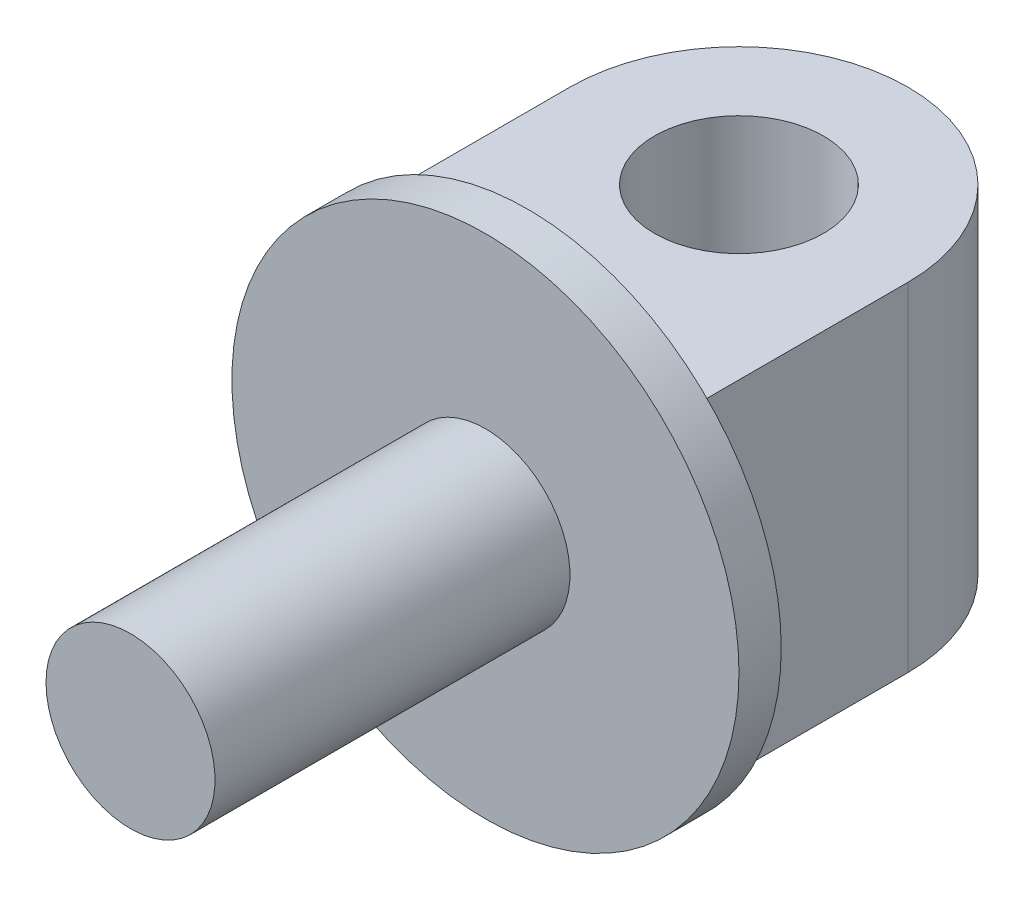
ISO-10303-21;
HEADER;
FILE_DESCRIPTION(('STEP AP214'),'2;1');
FILE_NAME('part.step','',(''),(''),'','','');
FILE_SCHEMA(('AUTOMOTIVE_DESIGN { 1 0 10303 214 1 1 1 1 }'));
ENDSEC;
DATA;
#1=APPLICATION_CONTEXT('core data for automotive mechanical design processes');
#2=APPLICATION_PROTOCOL_DEFINITION('international standard','automotive_design',2000,#1);
#3=PRODUCT_CONTEXT('',#1,'mechanical');
#4=PRODUCT('Part','Part','',(#3));
#5=PRODUCT_RELATED_PRODUCT_CATEGORY('part','',(#4));
#6=PRODUCT_DEFINITION_FORMATION('','',#4);
#7=PRODUCT_DEFINITION_CONTEXT('part definition',#1,'design');
#8=PRODUCT_DEFINITION('design','',#6,#7);
#9=PRODUCT_DEFINITION_SHAPE('','',#8);
#10=(LENGTH_UNIT() NAMED_UNIT(*) SI_UNIT(.MILLI.,.METRE.));
#11=(NAMED_UNIT(*) PLANE_ANGLE_UNIT() SI_UNIT($,.RADIAN.));
#12=(NAMED_UNIT(*) SI_UNIT($,.STERADIAN.) SOLID_ANGLE_UNIT());
#13=UNCERTAINTY_MEASURE_WITH_UNIT(LENGTH_MEASURE(1.E-05),#10,'distance_accuracy_value','');
#14=(GEOMETRIC_REPRESENTATION_CONTEXT(3) GLOBAL_UNCERTAINTY_ASSIGNED_CONTEXT((#13)) GLOBAL_UNIT_ASSIGNED_CONTEXT((#10,
#11,#12)) REPRESENTATION_CONTEXT('',''));
#15=CARTESIAN_POINT('',(0.,0.,0.));
#16=DIRECTION('',(0.,0.,1.));
#17=DIRECTION('',(1.,0.,0.));
#18=AXIS2_PLACEMENT_3D('',#15,#16,#17);
#19=CARTESIAN_POINT('',(0.,0.,-5.));
#20=DIRECTION('',(0.,0.,1.));
#21=DIRECTION('',(1.,0.,0.));
#22=AXIS2_PLACEMENT_3D('',#19,#20,#21);
#23=PLANE('',#22);
#24=CARTESIAN_POINT('',(0.,0.,-5.));
#25=DIRECTION('',(0.,0.,1.));
#26=DIRECTION('',(1.,0.,0.));
#27=AXIS2_PLACEMENT_3D('',#24,#25,#26);
#28=CIRCLE('',#27,30.);
#29=CARTESIAN_POINT('',(30.,0.,-5.));
#30=VERTEX_POINT('',#29);
#31=EDGE_CURVE('E41',#30,#30,#28,.T.);
#32=ORIENTED_EDGE('',*,*,#31,.F.);
#33=EDGE_LOOP('',(#32));
#34=FACE_BOUND('',#33,.T.);
#35=DIRECTION('',(0.,1.,0.));
#36=VECTOR('',#35,1.);
#37=CARTESIAN_POINT('',(-20.,20.,-5.));
#38=LINE('',#37,#36);
#39=CARTESIAN_POINT('',(-20.,-20.,-5.));
#40=VERTEX_POINT('',#39);
#41=CARTESIAN_POINT('',(-20.,20.,-5.));
#42=VERTEX_POINT('',#41);
#43=EDGE_CURVE('E49',#40,#42,#38,.T.);
#44=ORIENTED_EDGE('',*,*,#43,.F.);
#45=DIRECTION('',(-1.,0.,0.));
#46=VECTOR('',#45,1.);
#47=CARTESIAN_POINT('',(20.,-20.,-5.));
#48=LINE('',#47,#46);
#49=CARTESIAN_POINT('',(20.,-20.,-5.));
#50=VERTEX_POINT('',#49);
#51=EDGE_CURVE('E53',#50,#40,#48,.T.);
#52=ORIENTED_EDGE('',*,*,#51,.F.);
#53=DIRECTION('',(0.,-1.,0.));
#54=VECTOR('',#53,1.);
#55=CARTESIAN_POINT('',(20.,20.,-5.));
#56=LINE('',#55,#54);
#57=CARTESIAN_POINT('',(20.,20.,-5.));
#58=VERTEX_POINT('',#57);
#59=EDGE_CURVE('E109',#58,#50,#56,.T.);
#60=ORIENTED_EDGE('',*,*,#59,.F.);
#61=DIRECTION('',(1.,0.,0.));
#62=VECTOR('',#61,1.);
#63=CARTESIAN_POINT('',(20.,20.,-5.));
#64=LINE('',#63,#62);
#65=EDGE_CURVE('E106',#42,#58,#64,.T.);
#66=ORIENTED_EDGE('',*,*,#65,.F.);
#67=EDGE_LOOP('',(#44,#52,#60,#66));
#68=FACE_BOUND('',#67,.T.);
#69=ADVANCED_FACE('F32',(#34,#68),#23,.F.);
#70=CARTESIAN_POINT('',(0.,0.,-5.));
#71=DIRECTION('',(0.,0.,1.));
#72=DIRECTION('',(1.,0.,0.));
#73=AXIS2_PLACEMENT_3D('',#70,#71,#72);
#74=CYLINDRICAL_SURFACE('',#73,30.);
#75=ORIENTED_EDGE('',*,*,#31,.T.);
#76=EDGE_LOOP('',(#75));
#77=FACE_BOUND('',#76,.T.);
#78=CARTESIAN_POINT('',(0.,0.,0.));
#79=DIRECTION('',(0.,0.,1.));
#80=DIRECTION('',(1.,0.,0.));
#81=AXIS2_PLACEMENT_3D('',#78,#79,#80);
#82=CIRCLE('',#81,30.);
#83=CARTESIAN_POINT('',(30.,0.,0.));
#84=VERTEX_POINT('',#83);
#85=EDGE_CURVE('E36',#84,#84,#82,.T.);
#86=ORIENTED_EDGE('',*,*,#85,.F.);
#87=EDGE_LOOP('',(#86));
#88=FACE_BOUND('',#87,.T.);
#89=ADVANCED_FACE('F34',(#77,#88),#74,.T.);
#90=CARTESIAN_POINT('',(0.,0.,0.));
#91=DIRECTION('',(0.,0.,1.));
#92=DIRECTION('',(1.,0.,0.));
#93=AXIS2_PLACEMENT_3D('',#90,#91,#92);
#94=PLANE('',#93);
#95=CARTESIAN_POINT('',(0.,0.,0.));
#96=DIRECTION('',(0.,0.,1.));
#97=DIRECTION('',(1.,0.,0.));
#98=AXIS2_PLACEMENT_3D('',#95,#96,#97);
#99=CIRCLE('',#98,10.);
#100=CARTESIAN_POINT('',(-10.,0.,0.));
#101=VERTEX_POINT('',#100);
#102=EDGE_CURVE('E11',#101,#101,#99,.T.);
#103=ORIENTED_EDGE('',*,*,#102,.F.);
#104=EDGE_LOOP('',(#103));
#105=FACE_BOUND('',#104,.T.);
#106=ORIENTED_EDGE('',*,*,#85,.T.);
#107=EDGE_LOOP('',(#106));
#108=FACE_BOUND('',#107,.T.);
#109=ADVANCED_FACE('F125',(#105,#108),#94,.T.);
#110=CARTESIAN_POINT('',(0.,0.,42.));
#111=DIRECTION('',(0.,0.,-1.));
#112=DIRECTION('',(-1.,0.,0.));
#113=AXIS2_PLACEMENT_3D('',#110,#111,#112);
#114=CYLINDRICAL_SURFACE('',#113,10.);
#115=CARTESIAN_POINT('',(0.,0.,42.));
#116=DIRECTION('',(0.,0.,1.));
#117=DIRECTION('',(1.,0.,0.));
#118=AXIS2_PLACEMENT_3D('',#115,#116,#117);
#119=CIRCLE('',#118,10.);
#120=CARTESIAN_POINT('',(-10.,0.,42.));
#121=VERTEX_POINT('',#120);
#122=EDGE_CURVE('E117',#121,#121,#119,.T.);
#123=CARTESIAN_POINT('',(-10.,0.,42.));
#124=CARTESIAN_POINT('',(-10.,0.,41.5625));
#125=CARTESIAN_POINT('',(-10.,0.,41.125));
#126=CARTESIAN_POINT('',(-10.,0.,40.25));
#127=CARTESIAN_POINT('',(-10.,0.,39.8125));
#128=CARTESIAN_POINT('',(-10.,0.,38.9375));
#129=CARTESIAN_POINT('',(-10.,0.,38.5));
#130=CARTESIAN_POINT('',(-10.,0.,37.625));
#131=CARTESIAN_POINT('',(-10.,0.,37.1875));
#132=CARTESIAN_POINT('',(-10.,0.,36.3125));
#133=CARTESIAN_POINT('',(-10.,0.,35.875));
#134=CARTESIAN_POINT('',(-10.,0.,35.));
#135=CARTESIAN_POINT('',(-10.,0.,34.5625));
#136=CARTESIAN_POINT('',(-10.,0.,33.6875));
#137=CARTESIAN_POINT('',(-10.,0.,33.25));
#138=CARTESIAN_POINT('',(-10.,0.,32.375));
#139=CARTESIAN_POINT('',(-10.,0.,31.9375));
#140=CARTESIAN_POINT('',(-10.,0.,31.0625));
#141=CARTESIAN_POINT('',(-10.,0.,30.625));
#142=CARTESIAN_POINT('',(-10.,0.,29.75));
#143=CARTESIAN_POINT('',(-10.,0.,29.3125));
#144=CARTESIAN_POINT('',(-10.,0.,28.4375));
#145=CARTESIAN_POINT('',(-10.,0.,28.));
#146=CARTESIAN_POINT('',(-10.,0.,27.125));
#147=CARTESIAN_POINT('',(-10.,0.,26.6875));
#148=CARTESIAN_POINT('',(-10.,0.,25.8125));
#149=CARTESIAN_POINT('',(-10.,0.,25.375));
#150=CARTESIAN_POINT('',(-10.,0.,24.5));
#151=CARTESIAN_POINT('',(-10.,0.,24.0625));
#152=CARTESIAN_POINT('',(-10.,0.,23.1875));
#153=CARTESIAN_POINT('',(-10.,0.,22.75));
#154=CARTESIAN_POINT('',(-10.,0.,21.875));
#155=CARTESIAN_POINT('',(-10.,0.,21.4375));
#156=CARTESIAN_POINT('',(-10.,0.,20.5625));
#157=CARTESIAN_POINT('',(-10.,0.,20.125));
#158=CARTESIAN_POINT('',(-10.,0.,19.25));
#159=CARTESIAN_POINT('',(-10.,0.,18.8125));
#160=CARTESIAN_POINT('',(-10.,0.,17.9375));
#161=CARTESIAN_POINT('',(-10.,0.,17.5));
#162=CARTESIAN_POINT('',(-10.,0.,16.625));
#163=CARTESIAN_POINT('',(-10.,0.,16.1875));
#164=CARTESIAN_POINT('',(-10.,0.,15.3125));
#165=CARTESIAN_POINT('',(-10.,0.,14.875));
#166=CARTESIAN_POINT('',(-10.,0.,14.));
#167=CARTESIAN_POINT('',(-10.,0.,13.5625));
#168=CARTESIAN_POINT('',(-10.,0.,12.6875));
#169=CARTESIAN_POINT('',(-10.,0.,12.25));
#170=CARTESIAN_POINT('',(-10.,0.,11.375));
#171=CARTESIAN_POINT('',(-10.,0.,10.9375));
#172=CARTESIAN_POINT('',(-10.,0.,10.0625));
#173=CARTESIAN_POINT('',(-10.,0.,9.625));
#174=CARTESIAN_POINT('',(-10.,0.,8.75));
#175=CARTESIAN_POINT('',(-10.,0.,8.3125));
#176=CARTESIAN_POINT('',(-10.,0.,7.4375));
#177=CARTESIAN_POINT('',(-10.,0.,7.));
#178=CARTESIAN_POINT('',(-10.,0.,6.125));
#179=CARTESIAN_POINT('',(-10.,0.,5.6875));
#180=CARTESIAN_POINT('',(-10.,0.,4.8125));
#181=CARTESIAN_POINT('',(-10.,0.,4.375));
#182=CARTESIAN_POINT('',(-10.,0.,3.5));
#183=CARTESIAN_POINT('',(-10.,0.,3.0625));
#184=CARTESIAN_POINT('',(-10.,0.,2.1875));
#185=CARTESIAN_POINT('',(-10.,0.,1.75));
#186=CARTESIAN_POINT('',(-10.,0.,0.875000000000001));
#187=CARTESIAN_POINT('',(-10.,0.,0.4375));
#188=CARTESIAN_POINT('',(-10.,0.,0.));
#189=B_SPLINE_CURVE_WITH_KNOTS('',3,(#123,#124,#125,#126,#127,#128,#129,#130,#131,#132,#133,
#134,#135,#136,#137,#138,#139,#140,#141,#142,#143,#144,#145,#146,#147,#148,#149,#150,#151,#152,
#153,#154,#155,#156,#157,#158,#159,#160,#161,#162,#163,#164,#165,#166,#167,#168,#169,#170,#171,
#172,#173,#174,#175,#176,#177,#178,#179,#180,#181,#182,#183,#184,#185,#186,#187,#188),
.UNSPECIFIED.,.F.,.F.,(4,2,2,2,2,2,2,2,2,2,2,2,2,2,2,2,2,2,2,2,2,2,2,2,2,2,2,2,2,2,2,2,4),(0.,
1.3125,2.625,3.9375,5.25,6.56250000000001,7.875,9.1875,10.5,11.8125,13.125,14.4375,15.75,
17.0625,18.375,19.6875,21.,22.3125,23.625,24.9375,26.25,27.5625,28.875,30.1875,31.5,32.8125,
34.125,35.4375,36.75,38.0625,39.375,40.6875,42.),.UNSPECIFIED.);
#190=EDGE_CURVE('BSEAM132',#121,#101,#189,.T.);
#191=ORIENTED_EDGE('',*,*,#122,.F.);
#192=ORIENTED_EDGE('',*,*,#102,.T.);
#193=ORIENTED_EDGE('',*,*,#190,.T.);
#194=ORIENTED_EDGE('',*,*,#190,.F.);
#195=EDGE_LOOP('',(#191,#193,#192,#194));
#196=FACE_BOUND('',#195,.T.);
#197=ADVANCED_FACE('F132',(#196),#114,.T.);
#198=CARTESIAN_POINT('',(0.,0.,42.));
#199=DIRECTION('',(0.,0.,1.));
#200=DIRECTION('',(1.,0.,0.));
#201=AXIS2_PLACEMENT_3D('',#198,#199,#200);
#202=PLANE('',#201);
#203=ORIENTED_EDGE('',*,*,#122,.T.);
#204=EDGE_LOOP('',(#203));
#205=FACE_BOUND('',#204,.T.);
#206=ADVANCED_FACE('F141',(#205),#202,.T.);
#207=CARTESIAN_POINT('',(-20.,20.,-30.));
#208=DIRECTION('',(1.,0.,0.));
#209=DIRECTION('',(0.,1.,0.));
#210=AXIS2_PLACEMENT_3D('',#207,#208,#209);
#211=PLANE('',#210);
#212=ORIENTED_EDGE('',*,*,#43,.T.);
#213=DIRECTION('',(0.,0.,1.));
#214=VECTOR('',#213,1.);
#215=CARTESIAN_POINT('',(-20.,20.,-30.));
#216=LINE('',#215,#214);
#217=CARTESIAN_POINT('',(-20.,20.,-30.));
#218=VERTEX_POINT('',#217);
#219=EDGE_CURVE('E78',#218,#42,#216,.T.);
#220=ORIENTED_EDGE('',*,*,#219,.F.);
#221=DIRECTION('',(0.,1.,0.));
#222=VECTOR('',#221,1.);
#223=CARTESIAN_POINT('',(-20.,20.,-30.));
#224=LINE('',#223,#222);
#225=CARTESIAN_POINT('',(-20.,-20.,-30.));
#226=VERTEX_POINT('',#225);
#227=EDGE_CURVE('E73',#226,#218,#224,.T.);
#228=ORIENTED_EDGE('',*,*,#227,.F.);
#229=DIRECTION('',(0.,0.,1.));
#230=VECTOR('',#229,1.);
#231=CARTESIAN_POINT('',(-20.,-20.,-30.));
#232=LINE('',#231,#230);
#233=EDGE_CURVE('E76',#226,#40,#232,.T.);
#234=ORIENTED_EDGE('',*,*,#233,.T.);
#235=EDGE_LOOP('',(#212,#220,#228,#234));
#236=FACE_BOUND('',#235,.T.);
#237=ADVANCED_FACE('F75',(#236),#211,.F.);
#238=CARTESIAN_POINT('',(20.,20.,-30.));
#239=DIRECTION('',(0.,-1.,0.));
#240=DIRECTION('',(0.,0.,-1.));
#241=AXIS2_PLACEMENT_3D('',#238,#239,#240);
#242=PLANE('',#241);
#243=CARTESIAN_POINT('',(0.,20.,-30.));
#244=DIRECTION('',(0.,1.,0.));
#245=DIRECTION('',(0.,0.,1.));
#246=AXIS2_PLACEMENT_3D('',#243,#244,#245);
#247=CIRCLE('',#246,10.);
#248=CARTESIAN_POINT('',(0.,20.,-20.));
#249=VERTEX_POINT('',#248);
#250=EDGE_CURVE('E100',#249,#249,#247,.T.);
#251=ORIENTED_EDGE('',*,*,#250,.F.);
#252=EDGE_LOOP('',(#251));
#253=FACE_BOUND('',#252,.T.);
#254=ORIENTED_EDGE('',*,*,#65,.T.);
#255=DIRECTION('',(0.,0.,1.));
#256=VECTOR('',#255,1.);
#257=CARTESIAN_POINT('',(20.,20.,-30.));
#258=LINE('',#257,#256);
#259=CARTESIAN_POINT('',(20.,20.,-30.));
#260=VERTEX_POINT('',#259);
#261=EDGE_CURVE('E113',#260,#58,#258,.T.);
#262=ORIENTED_EDGE('',*,*,#261,.F.);
#263=CARTESIAN_POINT('',(0.,20.,-30.));
#264=DIRECTION('',(0.,-1.,0.));
#265=DIRECTION('',(0.,0.,-1.));
#266=AXIS2_PLACEMENT_3D('',#263,#264,#265);
#267=CIRCLE('',#266,20.);
#268=EDGE_CURVE('E95',#218,#260,#267,.T.);
#269=ORIENTED_EDGE('',*,*,#268,.F.);
#270=ORIENTED_EDGE('',*,*,#219,.T.);
#271=EDGE_LOOP('',(#254,#262,#269,#270));
#272=FACE_BOUND('',#271,.T.);
#273=ADVANCED_FACE('F148',(#253,#272),#242,.F.);
#274=CARTESIAN_POINT('',(20.,20.,-30.));
#275=DIRECTION('',(-1.,0.,0.));
#276=DIRECTION('',(0.,0.,1.));
#277=AXIS2_PLACEMENT_3D('',#274,#275,#276);
#278=PLANE('',#277);
#279=ORIENTED_EDGE('',*,*,#59,.T.);
#280=DIRECTION('',(0.,0.,1.));
#281=VECTOR('',#280,1.);
#282=CARTESIAN_POINT('',(20.,-20.,-30.));
#283=LINE('',#282,#281);
#284=CARTESIAN_POINT('',(20.,-20.,-30.));
#285=VERTEX_POINT('',#284);
#286=EDGE_CURVE('E90',#285,#50,#283,.T.);
#287=ORIENTED_EDGE('',*,*,#286,.F.);
#288=DIRECTION('',(0.,-1.,0.));
#289=VECTOR('',#288,1.);
#290=CARTESIAN_POINT('',(20.,20.,-30.));
#291=LINE('',#290,#289);
#292=EDGE_CURVE('E83',#260,#285,#291,.T.);
#293=ORIENTED_EDGE('',*,*,#292,.F.);
#294=ORIENTED_EDGE('',*,*,#261,.T.);
#295=EDGE_LOOP('',(#279,#287,#293,#294));
#296=FACE_BOUND('',#295,.T.);
#297=ADVANCED_FACE('F151',(#296),#278,.F.);
#298=CARTESIAN_POINT('',(20.,-20.,-30.));
#299=DIRECTION('',(0.,1.,0.));
#300=DIRECTION('',(0.,0.,1.));
#301=AXIS2_PLACEMENT_3D('',#298,#299,#300);
#302=PLANE('',#301);
#303=CARTESIAN_POINT('',(0.,-20.,-30.));
#304=DIRECTION('',(0.,1.,0.));
#305=DIRECTION('',(0.,0.,1.));
#306=AXIS2_PLACEMENT_3D('',#303,#304,#305);
#307=CIRCLE('',#306,10.);
#308=CARTESIAN_POINT('',(0.,-20.,-20.));
#309=VERTEX_POINT('',#308);
#310=EDGE_CURVE('E96',#309,#309,#307,.F.);
#311=ORIENTED_EDGE('',*,*,#310,.F.);
#312=EDGE_LOOP('',(#311));
#313=FACE_BOUND('',#312,.T.);
#314=ORIENTED_EDGE('',*,*,#51,.T.);
#315=ORIENTED_EDGE('',*,*,#233,.F.);
#316=CARTESIAN_POINT('',(0.,-20.,-30.));
#317=DIRECTION('',(0.,1.,0.));
#318=DIRECTION('',(0.,0.,1.));
#319=AXIS2_PLACEMENT_3D('',#316,#317,#318);
#320=CIRCLE('',#319,20.);
#321=EDGE_CURVE('E89',#226,#285,#320,.F.);
#322=ORIENTED_EDGE('',*,*,#321,.T.);
#323=ORIENTED_EDGE('',*,*,#286,.T.);
#324=EDGE_LOOP('',(#314,#315,#322,#323));
#325=FACE_BOUND('',#324,.T.);
#326=ADVANCED_FACE('F87',(#313,#325),#302,.F.);
#327=CARTESIAN_POINT('',(0.,64.7213595499958,-30.));
#328=DIRECTION('',(0.,-1.,0.));
#329=DIRECTION('',(0.,0.,-1.));
#330=AXIS2_PLACEMENT_3D('',#327,#328,#329);
#331=CYLINDRICAL_SURFACE('',#330,20.);
#332=ORIENTED_EDGE('',*,*,#227,.T.);
#333=ORIENTED_EDGE('',*,*,#268,.T.);
#334=ORIENTED_EDGE('',*,*,#292,.T.);
#335=ORIENTED_EDGE('',*,*,#321,.F.);
#336=EDGE_LOOP('',(#332,#333,#334,#335));
#337=FACE_BOUND('',#336,.T.);
#338=ADVANCED_FACE('F93',(#337),#331,.T.);
#339=CARTESIAN_POINT('',(0.,-48.2842712474619,-30.));
#340=DIRECTION('',(0.,1.,0.));
#341=DIRECTION('',(0.,0.,1.));
#342=AXIS2_PLACEMENT_3D('',#339,#340,#341);
#343=CYLINDRICAL_SURFACE('',#342,10.);
#344=ORIENTED_EDGE('',*,*,#310,.T.);
#345=EDGE_LOOP('',(#344));
#346=FACE_BOUND('',#345,.T.);
#347=ORIENTED_EDGE('',*,*,#250,.T.);
#348=EDGE_LOOP('',(#347));
#349=FACE_BOUND('',#348,.T.);
#350=ADVANCED_FACE('F161',(#346,#349),#343,.F.);
#351=CLOSED_SHELL('',(#69,#89,#109,#197,#206,#237,#273,#297,#326,#338,#350));
#352=MANIFOLD_SOLID_BREP('B2',#351);
#353=ADVANCED_BREP_SHAPE_REPRESENTATION('',(#18,#352),#14);
#354=SHAPE_DEFINITION_REPRESENTATION(#9,#353);
ENDSEC;
END-ISO-10303-21;
